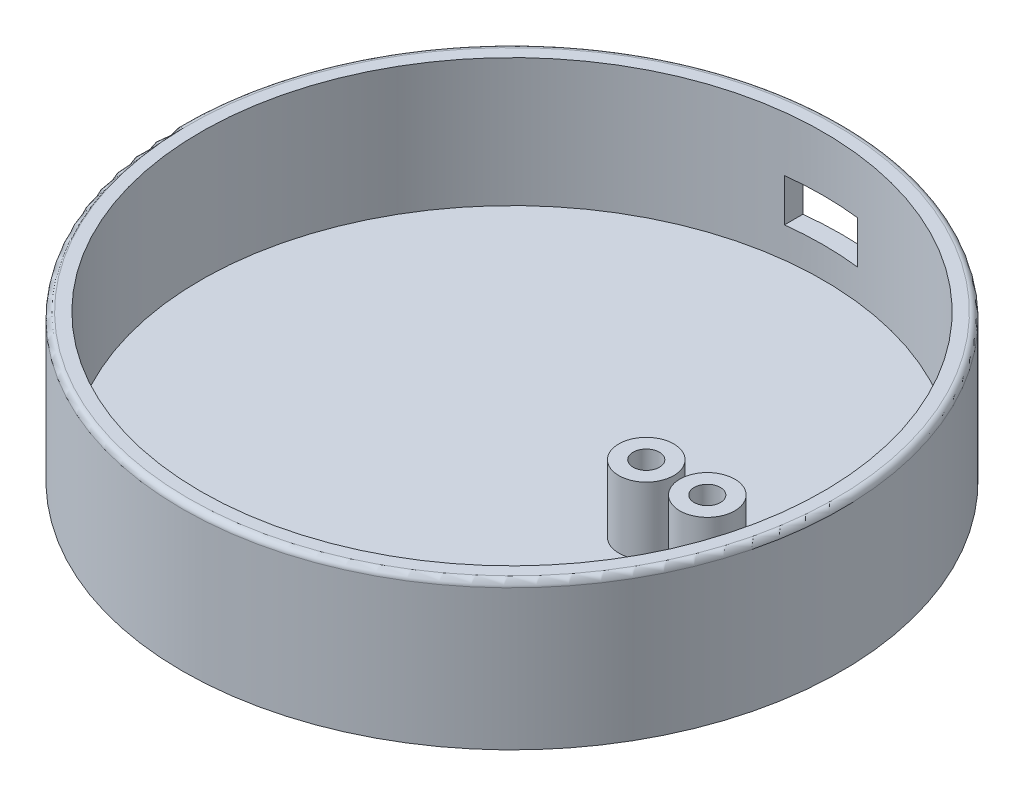
ISO-10303-21;
HEADER;
FILE_DESCRIPTION(('STEP AP214'),'2;1');
FILE_NAME('part.step','',(''),(''),'','','');
FILE_SCHEMA(('AUTOMOTIVE_DESIGN { 1 0 10303 214 1 1 1 1 }'));
ENDSEC;
DATA;
#1=APPLICATION_CONTEXT('core data for automotive mechanical design processes');
#2=APPLICATION_PROTOCOL_DEFINITION('international standard','automotive_design',2000,#1);
#3=PRODUCT_CONTEXT('',#1,'mechanical');
#4=PRODUCT('Part','Part','',(#3));
#5=PRODUCT_RELATED_PRODUCT_CATEGORY('part','',(#4));
#6=PRODUCT_DEFINITION_FORMATION('','',#4);
#7=PRODUCT_DEFINITION_CONTEXT('part definition',#1,'design');
#8=PRODUCT_DEFINITION('design','',#6,#7);
#9=PRODUCT_DEFINITION_SHAPE('','',#8);
#10=(LENGTH_UNIT() NAMED_UNIT(*) SI_UNIT(.MILLI.,.METRE.));
#11=(NAMED_UNIT(*) PLANE_ANGLE_UNIT() SI_UNIT($,.RADIAN.));
#12=(NAMED_UNIT(*) SI_UNIT($,.STERADIAN.) SOLID_ANGLE_UNIT());
#13=UNCERTAINTY_MEASURE_WITH_UNIT(LENGTH_MEASURE(1.E-05),#10,'distance_accuracy_value','');
#14=(GEOMETRIC_REPRESENTATION_CONTEXT(3) GLOBAL_UNCERTAINTY_ASSIGNED_CONTEXT((#13)) GLOBAL_UNIT_ASSIGNED_CONTEXT((#10,
#11,#12)) REPRESENTATION_CONTEXT('',''));
#15=CARTESIAN_POINT('',(0.,0.,0.));
#16=DIRECTION('',(0.,0.,1.));
#17=DIRECTION('',(1.,0.,0.));
#18=AXIS2_PLACEMENT_3D('',#15,#16,#17);
#19=CARTESIAN_POINT('',(0.,3.,0.));
#20=DIRECTION('',(0.,-1.,0.));
#21=DIRECTION('',(0.,0.,-1.));
#22=AXIS2_PLACEMENT_3D('',#19,#20,#21);
#23=CYLINDRICAL_SURFACE('',#22,54.);
#24=CARTESIAN_POINT('',(0.,23.,0.));
#25=DIRECTION('',(0.,1.,0.));
#26=DIRECTION('',(0.,0.,1.));
#27=AXIS2_PLACEMENT_3D('',#24,#25,#26);
#28=CIRCLE('',#27,54.);
#29=CARTESIAN_POINT('',(0.,23.,54.));
#30=VERTEX_POINT('',#29);
#31=EDGE_CURVE('E11',#30,#30,#28,.F.);
#32=ORIENTED_EDGE('',*,*,#31,.T.);
#33=EDGE_LOOP('',(#32));
#34=FACE_BOUND('',#33,.T.);
#35=CARTESIAN_POINT('',(0.,0.,0.));
#36=DIRECTION('',(0.,1.,0.));
#37=DIRECTION('',(0.,0.,1.));
#38=AXIS2_PLACEMENT_3D('',#35,#36,#37);
#39=CIRCLE('',#38,54.);
#40=CARTESIAN_POINT('',(0.,0.,54.));
#41=VERTEX_POINT('',#40);
#42=EDGE_CURVE('E125',#41,#41,#39,.T.);
#43=ORIENTED_EDGE('',*,*,#42,.T.);
#44=EDGE_LOOP('',(#43));
#45=FACE_BOUND('',#44,.T.);
#46=CARTESIAN_POINT('',(0.,15.,0.));
#47=DIRECTION('',(0.,-1.,0.));
#48=DIRECTION('',(0.,0.,-1.));
#49=AXIS2_PLACEMENT_3D('',#46,#47,#48);
#50=CIRCLE('',#49,54.);
#51=CARTESIAN_POINT('',(-6.,15.,-53.6656314599949));
#52=VERTEX_POINT('',#51);
#53=CARTESIAN_POINT('',(6.,15.,-53.6656314599949));
#54=VERTEX_POINT('',#53);
#55=EDGE_CURVE('E84',#52,#54,#50,.T.);
#56=ORIENTED_EDGE('',*,*,#55,.F.);
#57=DIRECTION('',(0.,-1.,0.));
#58=VECTOR('',#57,1.);
#59=CARTESIAN_POINT('',(-6.,3.,-53.6656314599949));
#60=LINE('',#59,#58);
#61=CARTESIAN_POINT('',(-6.,8.,-53.6656314599949));
#62=VERTEX_POINT('',#61);
#63=EDGE_CURVE('E90',#62,#52,#60,.F.);
#64=ORIENTED_EDGE('',*,*,#63,.F.);
#65=CARTESIAN_POINT('',(0.,8.,0.));
#66=DIRECTION('',(0.,-1.,0.));
#67=DIRECTION('',(0.,0.,-1.));
#68=AXIS2_PLACEMENT_3D('',#65,#66,#67);
#69=CIRCLE('',#68,54.);
#70=CARTESIAN_POINT('',(6.,8.,-53.6656314599949));
#71=VERTEX_POINT('',#70);
#72=EDGE_CURVE('E79',#62,#71,#69,.T.);
#73=ORIENTED_EDGE('',*,*,#72,.T.);
#74=DIRECTION('',(0.,-1.,0.));
#75=VECTOR('',#74,1.);
#76=CARTESIAN_POINT('',(6.,3.,-53.6656314599949));
#77=LINE('',#76,#75);
#78=EDGE_CURVE('E98',#54,#71,#77,.T.);
#79=ORIENTED_EDGE('',*,*,#78,.F.);
#80=EDGE_LOOP('',(#56,#64,#73,#79));
#81=FACE_BOUND('',#80,.T.);
#82=ADVANCED_FACE('F41',(#34,#45,#81),#23,.T.);
#83=CARTESIAN_POINT('',(0.,24.,0.));
#84=DIRECTION('',(0.,-1.,0.));
#85=DIRECTION('',(0.,0.,-1.));
#86=AXIS2_PLACEMENT_3D('',#83,#84,#85);
#87=CYLINDRICAL_SURFACE('',#86,51.);
#88=CARTESIAN_POINT('',(0.,3.,0.));
#89=DIRECTION('',(0.,1.,0.));
#90=DIRECTION('',(0.,0.,1.));
#91=AXIS2_PLACEMENT_3D('',#88,#89,#90);
#92=CIRCLE('',#91,51.);
#93=CARTESIAN_POINT('',(0.,3.,51.));
#94=VERTEX_POINT('',#93);
#95=EDGE_CURVE('E126',#94,#94,#92,.F.);
#96=ORIENTED_EDGE('',*,*,#95,.T.);
#97=EDGE_LOOP('',(#96));
#98=FACE_BOUND('',#97,.T.);
#99=CARTESIAN_POINT('',(0.,24.,0.));
#100=DIRECTION('',(0.,1.,0.));
#101=DIRECTION('',(0.,0.,1.));
#102=AXIS2_PLACEMENT_3D('',#99,#100,#101);
#103=CIRCLE('',#102,51.);
#104=CARTESIAN_POINT('',(0.,24.,51.));
#105=VERTEX_POINT('',#104);
#106=EDGE_CURVE('E122',#105,#105,#103,.T.);
#107=ORIENTED_EDGE('',*,*,#106,.T.);
#108=EDGE_LOOP('',(#107));
#109=FACE_BOUND('',#108,.T.);
#110=DIRECTION('',(0.,-1.,0.));
#111=VECTOR('',#110,1.);
#112=CARTESIAN_POINT('',(-6.,24.,-50.6458290484024));
#113=LINE('',#112,#111);
#114=CARTESIAN_POINT('',(-6.,8.,-50.6458290484024));
#115=VERTEX_POINT('',#114);
#116=CARTESIAN_POINT('',(-6.,15.,-50.6458290484024));
#117=VERTEX_POINT('',#116);
#118=EDGE_CURVE('E93',#115,#117,#113,.F.);
#119=ORIENTED_EDGE('',*,*,#118,.T.);
#120=CARTESIAN_POINT('',(0.,15.,0.));
#121=DIRECTION('',(0.,-1.,0.));
#122=DIRECTION('',(0.,0.,-1.));
#123=AXIS2_PLACEMENT_3D('',#120,#121,#122);
#124=CIRCLE('',#123,51.);
#125=CARTESIAN_POINT('',(6.,15.,-50.6458290484024));
#126=VERTEX_POINT('',#125);
#127=EDGE_CURVE('E141',#117,#126,#124,.T.);
#128=ORIENTED_EDGE('',*,*,#127,.T.);
#129=DIRECTION('',(0.,-1.,0.));
#130=VECTOR('',#129,1.);
#131=CARTESIAN_POINT('',(6.,24.,-50.6458290484024));
#132=LINE('',#131,#130);
#133=CARTESIAN_POINT('',(6.,8.,-50.6458290484024));
#134=VERTEX_POINT('',#133);
#135=EDGE_CURVE('E137',#126,#134,#132,.T.);
#136=ORIENTED_EDGE('',*,*,#135,.T.);
#137=CARTESIAN_POINT('',(0.,8.,0.));
#138=DIRECTION('',(0.,-1.,0.));
#139=DIRECTION('',(0.,0.,-1.));
#140=AXIS2_PLACEMENT_3D('',#137,#138,#139);
#141=CIRCLE('',#140,51.);
#142=EDGE_CURVE('E129',#115,#134,#141,.T.);
#143=ORIENTED_EDGE('',*,*,#142,.F.);
#144=EDGE_LOOP('',(#119,#128,#136,#143));
#145=FACE_BOUND('',#144,.T.);
#146=ADVANCED_FACE('F158',(#98,#109,#145),#87,.F.);
#147=CARTESIAN_POINT('',(0.,0.,0.));
#148=DIRECTION('',(0.,1.,0.));
#149=DIRECTION('',(0.,0.,1.));
#150=AXIS2_PLACEMENT_3D('',#147,#148,#149);
#151=PLANE('',#150);
#152=CARTESIAN_POINT('',(22.,0.,0.));
#153=DIRECTION('',(0.,1.,0.));
#154=DIRECTION('',(0.,0.,1.));
#155=AXIS2_PLACEMENT_3D('',#152,#153,#154);
#156=CIRCLE('',#155,2.15);
#157=CARTESIAN_POINT('',(22.,0.,2.15));
#158=VERTEX_POINT('',#157);
#159=EDGE_CURVE('E110',#158,#158,#156,.T.);
#160=ORIENTED_EDGE('',*,*,#159,.T.);
#161=EDGE_LOOP('',(#160));
#162=FACE_BOUND('',#161,.T.);
#163=CARTESIAN_POINT('',(32.,0.,0.));
#164=DIRECTION('',(0.,1.,0.));
#165=DIRECTION('',(0.,0.,1.));
#166=AXIS2_PLACEMENT_3D('',#163,#164,#165);
#167=CIRCLE('',#166,2.15);
#168=CARTESIAN_POINT('',(32.,0.,2.15));
#169=VERTEX_POINT('',#168);
#170=EDGE_CURVE('E101',#169,#169,#167,.T.);
#171=ORIENTED_EDGE('',*,*,#170,.T.);
#172=EDGE_LOOP('',(#171));
#173=FACE_BOUND('',#172,.T.);
#174=ORIENTED_EDGE('',*,*,#42,.F.);
#175=EDGE_LOOP('',(#174));
#176=FACE_BOUND('',#175,.T.);
#177=ADVANCED_FACE('F163',(#162,#173,#176),#151,.F.);
#178=CARTESIAN_POINT('',(0.,24.,0.));
#179=DIRECTION('',(0.,1.,0.));
#180=DIRECTION('',(0.,0.,1.));
#181=AXIS2_PLACEMENT_3D('',#178,#179,#180);
#182=PLANE('',#181);
#183=CARTESIAN_POINT('',(0.,24.,0.));
#184=DIRECTION('',(0.,1.,0.));
#185=DIRECTION('',(0.,0.,1.));
#186=AXIS2_PLACEMENT_3D('',#183,#184,#185);
#187=CIRCLE('',#186,53.);
#188=CARTESIAN_POINT('',(0.,24.,53.));
#189=VERTEX_POINT('',#188);
#190=EDGE_CURVE('E49',#189,#189,#187,.T.);
#191=ORIENTED_EDGE('',*,*,#190,.T.);
#192=EDGE_LOOP('',(#191));
#193=FACE_BOUND('',#192,.T.);
#194=ORIENTED_EDGE('',*,*,#106,.F.);
#195=EDGE_LOOP('',(#194));
#196=FACE_BOUND('',#195,.T.);
#197=ADVANCED_FACE('F146',(#193,#196),#182,.T.);
#198=CARTESIAN_POINT('',(0.,3.,0.));
#199=DIRECTION('',(0.,1.,0.));
#200=DIRECTION('',(0.,0.,1.));
#201=AXIS2_PLACEMENT_3D('',#198,#199,#200);
#202=PLANE('',#201);
#203=CARTESIAN_POINT('',(32.,3.,0.));
#204=DIRECTION('',(0.,1.,0.));
#205=DIRECTION('',(0.,0.,1.));
#206=AXIS2_PLACEMENT_3D('',#203,#204,#205);
#207=CIRCLE('',#206,4.5);
#208=CARTESIAN_POINT('',(32.,3.,4.5));
#209=VERTEX_POINT('',#208);
#210=EDGE_CURVE('E117',#209,#209,#207,.F.);
#211=ORIENTED_EDGE('',*,*,#210,.T.);
#212=EDGE_LOOP('',(#211));
#213=FACE_BOUND('',#212,.T.);
#214=CARTESIAN_POINT('',(22.,3.,0.));
#215=DIRECTION('',(0.,1.,0.));
#216=DIRECTION('',(0.,0.,1.));
#217=AXIS2_PLACEMENT_3D('',#214,#215,#216);
#218=CIRCLE('',#217,4.5);
#219=CARTESIAN_POINT('',(22.,3.,4.5));
#220=VERTEX_POINT('',#219);
#221=EDGE_CURVE('E121',#220,#220,#218,.F.);
#222=ORIENTED_EDGE('',*,*,#221,.T.);
#223=EDGE_LOOP('',(#222));
#224=FACE_BOUND('',#223,.T.);
#225=ORIENTED_EDGE('',*,*,#95,.F.);
#226=EDGE_LOOP('',(#225));
#227=FACE_BOUND('',#226,.T.);
#228=ADVANCED_FACE('F171',(#213,#224,#227),#202,.T.);
#229=CARTESIAN_POINT('',(22.,14.,0.));
#230=DIRECTION('',(0.,-1.,0.));
#231=DIRECTION('',(0.,0.,-1.));
#232=AXIS2_PLACEMENT_3D('',#229,#230,#231);
#233=CYLINDRICAL_SURFACE('',#232,4.5);
#234=ORIENTED_EDGE('',*,*,#221,.F.);
#235=EDGE_LOOP('',(#234));
#236=FACE_BOUND('',#235,.T.);
#237=CARTESIAN_POINT('',(22.,14.,0.));
#238=DIRECTION('',(0.,1.,0.));
#239=DIRECTION('',(0.,0.,1.));
#240=AXIS2_PLACEMENT_3D('',#237,#238,#239);
#241=CIRCLE('',#240,4.5);
#242=CARTESIAN_POINT('',(22.,14.,4.5));
#243=VERTEX_POINT('',#242);
#244=EDGE_CURVE('E118',#243,#243,#241,.T.);
#245=ORIENTED_EDGE('',*,*,#244,.F.);
#246=EDGE_LOOP('',(#245));
#247=FACE_BOUND('',#246,.T.);
#248=ADVANCED_FACE('F174',(#236,#247),#233,.T.);
#249=CARTESIAN_POINT('',(22.,14.,0.));
#250=DIRECTION('',(0.,1.,0.));
#251=DIRECTION('',(0.,0.,1.));
#252=AXIS2_PLACEMENT_3D('',#249,#250,#251);
#253=PLANE('',#252);
#254=CARTESIAN_POINT('',(22.,14.,0.));
#255=DIRECTION('',(0.,1.,0.));
#256=DIRECTION('',(0.,0.,1.));
#257=AXIS2_PLACEMENT_3D('',#254,#255,#256);
#258=CIRCLE('',#257,2.15);
#259=CARTESIAN_POINT('',(22.,14.,2.15));
#260=VERTEX_POINT('',#259);
#261=EDGE_CURVE('E106',#260,#260,#258,.T.);
#262=ORIENTED_EDGE('',*,*,#261,.F.);
#263=EDGE_LOOP('',(#262));
#264=FACE_BOUND('',#263,.T.);
#265=ORIENTED_EDGE('',*,*,#244,.T.);
#266=EDGE_LOOP('',(#265));
#267=FACE_BOUND('',#266,.T.);
#268=ADVANCED_FACE('F180',(#264,#267),#253,.T.);
#269=CARTESIAN_POINT('',(32.,14.,0.));
#270=DIRECTION('',(0.,-1.,0.));
#271=DIRECTION('',(0.,0.,-1.));
#272=AXIS2_PLACEMENT_3D('',#269,#270,#271);
#273=CYLINDRICAL_SURFACE('',#272,4.5);
#274=ORIENTED_EDGE('',*,*,#210,.F.);
#275=EDGE_LOOP('',(#274));
#276=FACE_BOUND('',#275,.T.);
#277=CARTESIAN_POINT('',(32.,14.,0.));
#278=DIRECTION('',(0.,1.,0.));
#279=DIRECTION('',(0.,0.,1.));
#280=AXIS2_PLACEMENT_3D('',#277,#278,#279);
#281=CIRCLE('',#280,4.5);
#282=CARTESIAN_POINT('',(32.,14.,4.5));
#283=VERTEX_POINT('',#282);
#284=EDGE_CURVE('E109',#283,#283,#281,.T.);
#285=ORIENTED_EDGE('',*,*,#284,.F.);
#286=EDGE_LOOP('',(#285));
#287=FACE_BOUND('',#286,.T.);
#288=ADVANCED_FACE('F184',(#276,#287),#273,.T.);
#289=CARTESIAN_POINT('',(32.,14.,0.));
#290=DIRECTION('',(0.,1.,0.));
#291=DIRECTION('',(0.,0.,1.));
#292=AXIS2_PLACEMENT_3D('',#289,#290,#291);
#293=PLANE('',#292);
#294=CARTESIAN_POINT('',(32.,14.,0.));
#295=DIRECTION('',(0.,1.,0.));
#296=DIRECTION('',(0.,0.,1.));
#297=AXIS2_PLACEMENT_3D('',#294,#295,#296);
#298=CIRCLE('',#297,2.15);
#299=CARTESIAN_POINT('',(32.,14.,2.15));
#300=VERTEX_POINT('',#299);
#301=EDGE_CURVE('E97',#300,#300,#298,.T.);
#302=ORIENTED_EDGE('',*,*,#301,.F.);
#303=EDGE_LOOP('',(#302));
#304=FACE_BOUND('',#303,.T.);
#305=ORIENTED_EDGE('',*,*,#284,.T.);
#306=EDGE_LOOP('',(#305));
#307=FACE_BOUND('',#306,.T.);
#308=ADVANCED_FACE('F186',(#304,#307),#293,.T.);
#309=CARTESIAN_POINT('',(32.,14.,0.));
#310=DIRECTION('',(0.,-1.,0.));
#311=DIRECTION('',(0.,0.,-1.));
#312=AXIS2_PLACEMENT_3D('',#309,#310,#311);
#313=CYLINDRICAL_SURFACE('',#312,2.15);
#314=ORIENTED_EDGE('',*,*,#301,.T.);
#315=EDGE_LOOP('',(#314));
#316=FACE_BOUND('',#315,.T.);
#317=ORIENTED_EDGE('',*,*,#170,.F.);
#318=EDGE_LOOP('',(#317));
#319=FACE_BOUND('',#318,.T.);
#320=ADVANCED_FACE('F189',(#316,#319),#313,.F.);
#321=CARTESIAN_POINT('',(22.,14.,0.));
#322=DIRECTION('',(0.,-1.,0.));
#323=DIRECTION('',(0.,0.,-1.));
#324=AXIS2_PLACEMENT_3D('',#321,#322,#323);
#325=CYLINDRICAL_SURFACE('',#324,2.15);
#326=ORIENTED_EDGE('',*,*,#261,.T.);
#327=EDGE_LOOP('',(#326));
#328=FACE_BOUND('',#327,.T.);
#329=ORIENTED_EDGE('',*,*,#159,.F.);
#330=EDGE_LOOP('',(#329));
#331=FACE_BOUND('',#330,.T.);
#332=ADVANCED_FACE('F196',(#328,#331),#325,.F.);
#333=CARTESIAN_POINT('',(-6.,15.,-49.));
#334=DIRECTION('',(1.,0.,0.));
#335=DIRECTION('',(0.,0.,-1.));
#336=AXIS2_PLACEMENT_3D('',#333,#334,#335);
#337=PLANE('',#336);
#338=ORIENTED_EDGE('',*,*,#63,.T.);
#339=DIRECTION('',(0.,0.,1.));
#340=VECTOR('',#339,1.);
#341=CARTESIAN_POINT('',(-6.,15.,-49.));
#342=LINE('',#341,#340);
#343=EDGE_CURVE('E213',#52,#117,#342,.T.);
#344=ORIENTED_EDGE('',*,*,#343,.T.);
#345=ORIENTED_EDGE('',*,*,#118,.F.);
#346=DIRECTION('',(0.,0.,1.));
#347=VECTOR('',#346,1.);
#348=CARTESIAN_POINT('',(-6.,8.,-49.));
#349=LINE('',#348,#347);
#350=EDGE_CURVE('E61',#62,#115,#349,.T.);
#351=ORIENTED_EDGE('',*,*,#350,.F.);
#352=EDGE_LOOP('',(#338,#344,#345,#351));
#353=FACE_BOUND('',#352,.T.);
#354=ADVANCED_FACE('F88',(#353),#337,.T.);
#355=CARTESIAN_POINT('',(6.,15.,-49.));
#356=DIRECTION('',(-1.,0.,0.));
#357=DIRECTION('',(0.,0.,1.));
#358=AXIS2_PLACEMENT_3D('',#355,#356,#357);
#359=PLANE('',#358);
#360=ORIENTED_EDGE('',*,*,#78,.T.);
#361=DIRECTION('',(0.,0.,-1.));
#362=VECTOR('',#361,1.);
#363=CARTESIAN_POINT('',(6.,8.,-49.));
#364=LINE('',#363,#362);
#365=EDGE_CURVE('E56',#134,#71,#364,.T.);
#366=ORIENTED_EDGE('',*,*,#365,.F.);
#367=ORIENTED_EDGE('',*,*,#135,.F.);
#368=DIRECTION('',(0.,0.,-1.));
#369=VECTOR('',#368,1.);
#370=CARTESIAN_POINT('',(6.,15.,-49.));
#371=LINE('',#370,#369);
#372=EDGE_CURVE('E85',#126,#54,#371,.T.);
#373=ORIENTED_EDGE('',*,*,#372,.T.);
#374=EDGE_LOOP('',(#360,#366,#367,#373));
#375=FACE_BOUND('',#374,.T.);
#376=ADVANCED_FACE('F203',(#375),#359,.T.);
#377=CARTESIAN_POINT('',(0.,15.,0.));
#378=DIRECTION('',(0.,-1.,0.));
#379=DIRECTION('',(0.,0.,-1.));
#380=AXIS2_PLACEMENT_3D('',#377,#378,#379);
#381=PLANE('',#380);
#382=ORIENTED_EDGE('',*,*,#55,.T.);
#383=ORIENTED_EDGE('',*,*,#372,.F.);
#384=ORIENTED_EDGE('',*,*,#127,.F.);
#385=ORIENTED_EDGE('',*,*,#343,.F.);
#386=EDGE_LOOP('',(#382,#383,#384,#385));
#387=FACE_BOUND('',#386,.T.);
#388=ADVANCED_FACE('F154',(#387),#381,.T.);
#389=CARTESIAN_POINT('',(0.,8.,0.));
#390=DIRECTION('',(0.,-1.,0.));
#391=DIRECTION('',(0.,0.,-1.));
#392=AXIS2_PLACEMENT_3D('',#389,#390,#391);
#393=PLANE('',#392);
#394=ORIENTED_EDGE('',*,*,#350,.T.);
#395=ORIENTED_EDGE('',*,*,#142,.T.);
#396=ORIENTED_EDGE('',*,*,#365,.T.);
#397=ORIENTED_EDGE('',*,*,#72,.F.);
#398=EDGE_LOOP('',(#394,#395,#396,#397));
#399=FACE_BOUND('',#398,.T.);
#400=ADVANCED_FACE('F80',(#399),#393,.F.);
#401=CARTESIAN_POINT('',(0.,23.,0.));
#402=DIRECTION('',(0.,1.,0.));
#403=DIRECTION('',(0.,0.,1.));
#404=AXIS2_PLACEMENT_3D('',#401,#402,#403);
#405=TOROIDAL_SURFACE('',#404,53.,1.);
#406=ORIENTED_EDGE('',*,*,#31,.F.);
#407=EDGE_LOOP('',(#406));
#408=FACE_BOUND('',#407,.T.);
#409=ORIENTED_EDGE('',*,*,#190,.F.);
#410=EDGE_LOOP('',(#409));
#411=FACE_BOUND('',#410,.T.);
#412=ADVANCED_FACE('F43',(#408,#411),#405,.T.);
#413=CLOSED_SHELL('',(#82,#146,#177,#197,#228,#248,#268,#288,#308,#320,#332,#354,#376,#388,#400,#412));
#414=MANIFOLD_SOLID_BREP('B2',#413);
#415=ADVANCED_BREP_SHAPE_REPRESENTATION('',(#18,#414),#14);
#416=SHAPE_DEFINITION_REPRESENTATION(#9,#415);
ENDSEC;
END-ISO-10303-21;
